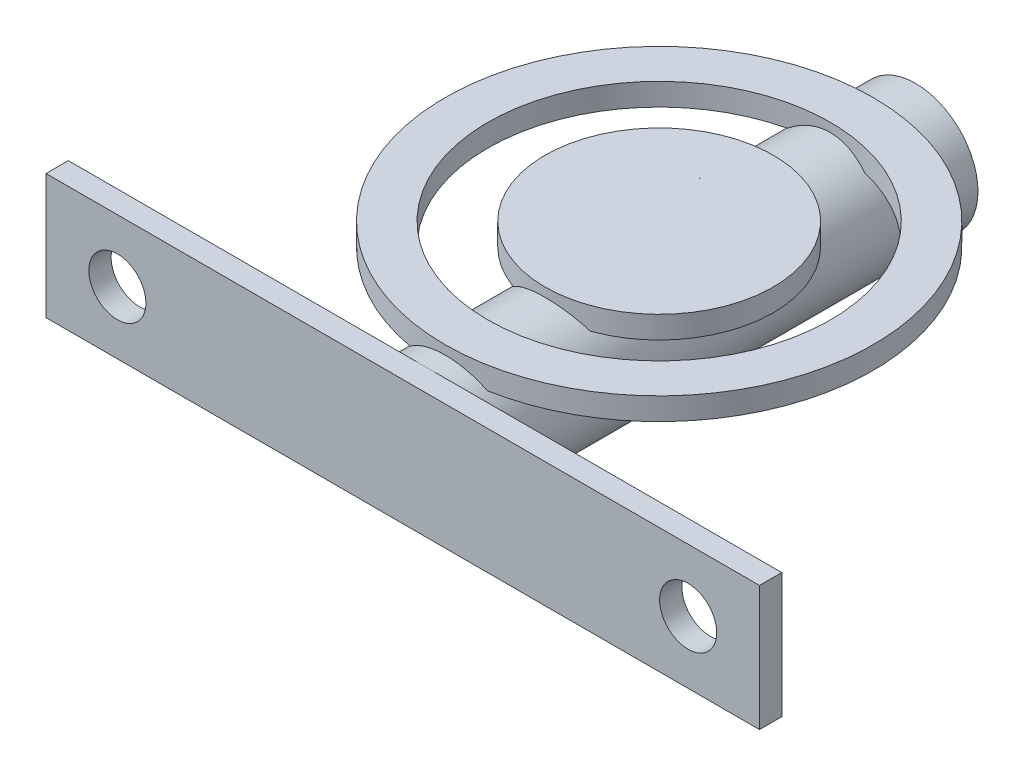
ISO-10303-21;
HEADER;
FILE_DESCRIPTION(('STEP AP214'),'2;1');
FILE_NAME('part.step','',(''),(''),'','','');
FILE_SCHEMA(('AUTOMOTIVE_DESIGN { 1 0 10303 214 1 1 1 1 }'));
ENDSEC;
DATA;
#1=APPLICATION_CONTEXT('core data for automotive mechanical design processes');
#2=APPLICATION_PROTOCOL_DEFINITION('international standard','automotive_design',2000,#1);
#3=PRODUCT_CONTEXT('',#1,'mechanical');
#4=PRODUCT('Part','Part','',(#3));
#5=PRODUCT_RELATED_PRODUCT_CATEGORY('part','',(#4));
#6=PRODUCT_DEFINITION_FORMATION('','',#4);
#7=PRODUCT_DEFINITION_CONTEXT('part definition',#1,'design');
#8=PRODUCT_DEFINITION('design','',#6,#7);
#9=PRODUCT_DEFINITION_SHAPE('','',#8);
#10=(LENGTH_UNIT() NAMED_UNIT(*) SI_UNIT(.MILLI.,.METRE.));
#11=(NAMED_UNIT(*) PLANE_ANGLE_UNIT() SI_UNIT($,.RADIAN.));
#12=(NAMED_UNIT(*) SI_UNIT($,.STERADIAN.) SOLID_ANGLE_UNIT());
#13=UNCERTAINTY_MEASURE_WITH_UNIT(LENGTH_MEASURE(1.E-05),#10,'distance_accuracy_value','');
#14=(GEOMETRIC_REPRESENTATION_CONTEXT(3) GLOBAL_UNCERTAINTY_ASSIGNED_CONTEXT((#13)) GLOBAL_UNIT_ASSIGNED_CONTEXT((#10,
#11,#12)) REPRESENTATION_CONTEXT('',''));
#15=CARTESIAN_POINT('',(0.,0.,0.));
#16=DIRECTION('',(0.,0.,1.));
#17=DIRECTION('',(1.,0.,0.));
#18=AXIS2_PLACEMENT_3D('',#15,#16,#17);
#19=CARTESIAN_POINT('',(0.,0.,27.5));
#20=DIRECTION('',(0.,0.,-1.));
#21=DIRECTION('',(-1.,0.,0.));
#22=AXIS2_PLACEMENT_3D('',#19,#20,#21);
#23=CYLINDRICAL_SURFACE('',#22,3.5);
#24=DIRECTION('',(0.,0.,-1.));
#25=VECTOR('',#24,1.);
#26=CARTESIAN_POINT('',(2.1650635094611,2.75,27.5));
#27=LINE('',#26,#25);
#28=CARTESIAN_POINT('',(2.1650635094611,2.75,26.1780716341129));
#29=VERTEX_POINT('',#28);
#30=CARTESIAN_POINT('',(2.1650635094611,2.75,23.7276734145911));
#31=VERTEX_POINT('',#30);
#32=EDGE_CURVE('E64',#29,#31,#27,.T.);
#33=ORIENTED_EDGE('',*,*,#32,.F.);
#34=CARTESIAN_POINT('',(2.1650635094611,2.75,26.1780716341129));
#35=CARTESIAN_POINT('',(2.08923507612227,2.80970782312858,26.1919859361159));
#36=CARTESIAN_POINT('',(2.01089348860059,2.86629627500496,26.205596187318));
#37=CARTESIAN_POINT('',(1.84968025724275,2.97287921046471,26.2318682263467));
#38=CARTESIAN_POINT('',(1.76680796641174,3.02287274878205,26.244529878096));
#39=CARTESIAN_POINT('',(1.5969553824648,3.1159460414292,26.2685737941807));
#40=CARTESIAN_POINT('',(1.50997053972057,3.15901789531874,26.2799545921679));
#41=CARTESIAN_POINT('',(1.3325927656807,3.23784335477752,26.3011140756907));
#42=CARTESIAN_POINT('',(1.24220005154245,3.27359742572245,26.3108928630986));
#43=CARTESIAN_POINT('',(0.966513524701702,3.36951806181858,26.3374324857215));
#44=CARTESIAN_POINT('',(0.776810018098517,3.41828895035713,26.3513821352277));
#45=CARTESIAN_POINT('',(0.391799068541982,3.48347551788956,26.3701499978747));
#46=CARTESIAN_POINT('',(0.196498951607603,3.49993169559008,26.3749796404557));
#47=CARTESIAN_POINT('',(-0.189204726580534,3.50006618643793,26.3750197308492));
#48=CARTESIAN_POINT('',(-0.379608442531774,3.48455494954174,26.3704680181214));
#49=CARTESIAN_POINT('',(-0.755252719672539,3.42283892258634,26.3526855106333));
#50=CARTESIAN_POINT('',(-0.940487155426601,3.3765992059086,26.3394448400405));
#51=CARTESIAN_POINT('',(-1.21492882473966,3.28389529786848,26.3137212722393));
#52=CARTESIAN_POINT('',(-1.30806806343169,3.24790826750086,26.3038491809761));
#53=CARTESIAN_POINT('',(-1.49080673635844,3.16818866535957,26.2823900326736));
#54=CARTESIAN_POINT('',(-1.58040574544987,3.12445516675563,26.270802770449));
#55=CARTESIAN_POINT('',(-1.75534151494423,3.02963211048425,26.2462498490367));
#56=CARTESIAN_POINT('',(-1.84068083428746,2.97854704256386,26.2332850324038));
#57=CARTESIAN_POINT('',(-2.00658541927086,2.86940493823545,26.2063443941294));
#58=CARTESIAN_POINT('',(-2.08715163822699,2.81134930109518,26.192368775619));
#59=CARTESIAN_POINT('',(-2.1650635094611,2.75,26.1780716341129));
#60=B_SPLINE_CURVE_WITH_KNOTS('',3,(#34,#35,#36,#37,#38,#39,#40,#41,#42,#43,#44,#45,#46,#47,#48,
#49,#50,#51,#52,#53,#54,#55,#56,#57,#58,#59),.UNSPECIFIED.,.F.,.F.,(4,2,2,2,2,2,2,2,2,2,2,2,4),
(0.,0.292453883633062,0.584949639997232,0.877776916713826,1.170585565238,1.75653892562013,
2.341757464733,2.91232194339314,3.48353604904825,3.78423065544071,4.08496126292863,
4.38550898170442,4.68599646926957),.UNSPECIFIED.);
#61=CARTESIAN_POINT('',(-2.1650635094611,2.75,26.1780716341129));
#62=VERTEX_POINT('',#61);
#63=EDGE_CURVE('E133',#29,#62,#60,.T.);
#64=ORIENTED_EDGE('',*,*,#63,.T.);
#65=DIRECTION('',(0.,0.,-1.));
#66=VECTOR('',#65,1.);
#67=CARTESIAN_POINT('',(-2.1650635094611,2.75,27.5));
#68=LINE('',#67,#66);
#69=CARTESIAN_POINT('',(-2.1650635094611,2.75,23.7276734145911));
#70=VERTEX_POINT('',#69);
#71=EDGE_CURVE('E136',#70,#62,#68,.F.);
#72=ORIENTED_EDGE('',*,*,#71,.F.);
#73=CARTESIAN_POINT('',(2.1650635094611,2.75,23.7276734145911));
#74=CARTESIAN_POINT('',(2.09007848964643,2.80904203228148,23.7450376177243));
#75=CARTESIAN_POINT('',(2.01261334468774,2.8650545994467,23.7620143066468));
#76=CARTESIAN_POINT('',(1.85316940396815,2.97067361021915,23.7947856266313));
#77=CARTESIAN_POINT('',(1.77118951919789,3.02027849847833,23.8105799703107));
#78=CARTESIAN_POINT('',(1.60303283061728,3.11279769179636,23.8406005101795));
#79=CARTESIAN_POINT('',(1.51684802247563,3.15569852687977,23.8548235328514));
#80=CARTESIAN_POINT('',(1.34101670947158,3.2343413142549,23.8812926884846));
#81=CARTESIAN_POINT('',(1.25137051701032,3.27008391080771,23.8935389993361));
#82=CARTESIAN_POINT('',(0.977703230001124,3.366219384923,23.9268448076211));
#83=CARTESIAN_POINT('',(0.789144472790432,3.41541464699033,23.944435926958));
#84=CARTESIAN_POINT('',(0.406167809361418,3.48177525672721,23.9683203626207));
#85=CARTESIAN_POINT('',(0.211760585692279,3.49899578026638,23.9746331402319));
#86=CARTESIAN_POINT('',(-0.169892828320654,3.50088277387004,23.9753225550294));
#87=CARTESIAN_POINT('',(-0.35713329139373,3.4867495044247,23.97013927672));
#88=CARTESIAN_POINT('',(-0.726725914208579,3.4288306742192,23.9492438433954));
#89=CARTESIAN_POINT('',(-0.909069929613905,3.38499855002254,23.9335151551347));
#90=CARTESIAN_POINT('',(-1.18421614941736,3.29519570318456,23.9021954517334));
#91=CARTESIAN_POINT('',(-1.28066393640044,3.25890837573135,23.8896753166443));
#92=CARTESIAN_POINT('',(-1.46975856808108,3.17810770633876,23.8623028971652));
#93=CARTESIAN_POINT('',(-1.56240456577576,3.13359254334379,23.8474500965991));
#94=CARTESIAN_POINT('',(-1.74308425979773,3.03679995855194,23.8158717594929));
#95=CARTESIAN_POINT('',(-1.8311222042003,2.98452986266632,23.7991479940392));
#96=CARTESIAN_POINT('',(-2.00207060569453,2.87265656727054,23.7643214589913));
#97=CARTESIAN_POINT('',(-2.08498306705242,2.81305626176847,23.7462192346886));
#98=CARTESIAN_POINT('',(-2.1650635094611,2.75,23.7276734145911));
#99=B_SPLINE_CURVE_WITH_KNOTS('',3,(#73,#74,#75,#76,#77,#78,#79,#80,#81,#82,#83,#84,#85,#86,#87,
#88,#89,#90,#91,#92,#93,#94,#95,#96,#97,#98),.UNSPECIFIED.,.F.,.F.,(4,2,2,2,2,2,2,2,2,2,2,2,4),
(0.,0.290944339311271,0.581959167916546,0.873551395328674,1.16511736683517,1.74890372302307,
2.33168175312336,2.89253663216908,3.45427289019452,3.76532947560772,4.07645498936921,
4.38728843953659,4.69799956248631),.UNSPECIFIED.);
#100=EDGE_CURVE('E143',#31,#70,#99,.T.);
#101=ORIENTED_EDGE('',*,*,#100,.F.);
#102=EDGE_LOOP('',(#33,#64,#72,#101));
#103=FACE_BOUND('',#102,.T.);
#104=CARTESIAN_POINT('',(0.,0.,0.));
#105=DIRECTION('',(0.,0.,1.));
#106=DIRECTION('',(1.,0.,0.));
#107=AXIS2_PLACEMENT_3D('',#104,#105,#106);
#108=CIRCLE('',#107,3.5);
#109=CARTESIAN_POINT('',(3.5,0.,0.));
#110=VERTEX_POINT('',#109);
#111=EDGE_CURVE('E223',#110,#110,#108,.T.);
#112=ORIENTED_EDGE('',*,*,#111,.T.);
#113=EDGE_LOOP('',(#112));
#114=FACE_BOUND('',#113,.T.);
#115=CARTESIAN_POINT('',(0.,0.,27.5));
#116=DIRECTION('',(0.,0.,1.));
#117=DIRECTION('',(1.,0.,0.));
#118=AXIS2_PLACEMENT_3D('',#115,#116,#117);
#119=CIRCLE('',#118,3.5);
#120=CARTESIAN_POINT('',(0.,3.5,27.5));
#121=VERTEX_POINT('',#120);
#122=CARTESIAN_POINT('',(0.,-3.5,27.5));
#123=VERTEX_POINT('',#122);
#124=EDGE_CURVE('E226',#121,#123,#119,.T.);
#125=ORIENTED_EDGE('',*,*,#124,.F.);
#126=EDGE_CURVE('E230',#123,#121,#119,.T.);
#127=ORIENTED_EDGE('',*,*,#126,.F.);
#128=EDGE_LOOP('',(#125,#127));
#129=FACE_BOUND('',#128,.T.);
#130=DIRECTION('',(0.,0.,-1.));
#131=VECTOR('',#130,1.);
#132=CARTESIAN_POINT('',(2.1650635094611,2.75,27.5));
#133=LINE('',#132,#131);
#134=CARTESIAN_POINT('',(2.1650635094611,2.75,20.3976655228395));
#135=VERTEX_POINT('',#134);
#136=CARTESIAN_POINT('',(2.1650635094611,2.75,8.35233447716047));
#137=VERTEX_POINT('',#136);
#138=EDGE_CURVE('E153',#135,#137,#133,.T.);
#139=ORIENTED_EDGE('',*,*,#138,.F.);
#140=CARTESIAN_POINT('',(2.1650635094611,2.75,20.3976655228395));
#141=CARTESIAN_POINT('',(2.09297858717266,2.8067539200769,20.423585994043));
#142=CARTESIAN_POINT('',(2.01851190059977,2.86078744533916,20.4488872352543));
#143=CARTESIAN_POINT('',(1.86510959308769,2.96308447089887,20.497730495681));
#144=CARTESIAN_POINT('',(1.78617156953678,3.01134482488161,20.521271553019));
#145=CARTESIAN_POINT('',(1.62389224901648,3.10187567065977,20.5661295036181));
#146=CARTESIAN_POINT('',(1.54053535324926,3.1441226936967,20.5874376011903));
#147=CARTESIAN_POINT('',(1.37018655086965,3.22201412479249,20.627220356005));
#148=CARTESIAN_POINT('',(1.28319526328825,3.25765965168328,20.6456954932906));
#149=CARTESIAN_POINT('',(1.01679624477149,3.35437025956068,20.6962909959456));
#150=CARTESIAN_POINT('',(0.832431300063351,3.40494663630421,20.7234479593418));
#151=CARTESIAN_POINT('',(0.456744823871,3.47531681050127,20.7614656694579));
#152=CARTESIAN_POINT('',(0.265440616401544,3.49518250323219,20.7723644752491));
#153=CARTESIAN_POINT('',(-0.103883967943103,3.50296702389805,20.7766235405937));
#154=CARTESIAN_POINT('',(-0.281845256629886,3.49313048667505,20.7712161243156));
#155=CARTESIAN_POINT('',(-0.633340200465273,3.44678562247987,20.7460245958241));
#156=CARTESIAN_POINT('',(-0.806870028911887,3.41025500011838,20.7262284659668));
#157=CARTESIAN_POINT('',(-1.14205836519336,3.31296475841078,20.6745297390603));
#158=CARTESIAN_POINT('',(-1.3038572664223,3.25258201989533,20.6428158142741));
#159=CARTESIAN_POINT('',(-1.61498961395128,3.10983363281752,20.5699420236918));
#160=CARTESIAN_POINT('',(-1.76433418873819,3.02748789152451,20.5287907166513));
#161=CARTESIAN_POINT('',(-1.95085122950528,2.90637758208994,20.4706040786042));
#162=CARTESIAN_POINT('',(-1.99480941859512,2.87638058468757,20.4563501356682));
#163=CARTESIAN_POINT('',(-2.08112157786131,2.81455840175316,20.4273544325555));
#164=CARTESIAN_POINT('',(-2.12347839324996,2.78273673853616,20.412613634081));
#165=CARTESIAN_POINT('',(-2.16506350946117,2.75000000000012,20.3976655228395));
#166=B_SPLINE_CURVE_WITH_KNOTS('',3,(#140,#141,#142,#143,#144,#145,#146,#147,#148,#149,#150,
#151,#152,#153,#154,#155,#156,#157,#158,#159,#160,#161,#162,#163,#164,#165),.UNSPECIFIED.,.F.,
.F.,(4,2,2,2,2,2,2,2,2,2,2,2,4),(0.,0.285958361441755,0.572071863820251,0.859273065727793,
1.14642554769114,1.7223679371048,2.2969599631703,2.82924306387309,3.36197124606037,
3.88659859525999,4.41075202868991,4.57599672517809,4.74093252422038),.UNSPECIFIED.);
#167=CARTESIAN_POINT('',(-2.1650635094611,2.75,20.3976655228395));
#168=VERTEX_POINT('',#167);
#169=EDGE_CURVE('E246',#135,#168,#166,.T.);
#170=ORIENTED_EDGE('',*,*,#169,.T.);
#171=DIRECTION('',(0.,0.,-1.));
#172=VECTOR('',#171,1.);
#173=CARTESIAN_POINT('',(-2.1650635094611,2.75,27.5));
#174=LINE('',#173,#172);
#175=CARTESIAN_POINT('',(-2.1650635094611,2.75,8.35233447716047));
#176=VERTEX_POINT('',#175);
#177=EDGE_CURVE('E229',#176,#168,#174,.F.);
#178=ORIENTED_EDGE('',*,*,#177,.F.);
#179=CARTESIAN_POINT('',(-2.1650635094611,2.75,8.35233447716047));
#180=CARTESIAN_POINT('',(-2.09297858717266,2.8067539200769,8.32641400595699));
#181=CARTESIAN_POINT('',(-2.01851190059977,2.86078744533916,8.3011127647457));
#182=CARTESIAN_POINT('',(-1.86510959308769,2.96308447089887,8.25226950431897));
#183=CARTESIAN_POINT('',(-1.78617156953678,3.01134482488161,8.22872844698104));
#184=CARTESIAN_POINT('',(-1.62389224901648,3.10187567065977,8.18387049638189));
#185=CARTESIAN_POINT('',(-1.54053535324926,3.1441226936967,8.16256239880969));
#186=CARTESIAN_POINT('',(-1.37018655086965,3.22201412479249,8.122779643995));
#187=CARTESIAN_POINT('',(-1.28319526328825,3.25765965168328,8.10430450670944));
#188=CARTESIAN_POINT('',(-1.01679624477149,3.35437025956068,8.05370900405438));
#189=CARTESIAN_POINT('',(-0.83243130006335,3.40494663630421,8.02655204065818));
#190=CARTESIAN_POINT('',(-0.456744823871,3.47531681050127,7.98853433054215));
#191=CARTESIAN_POINT('',(-0.265440616401544,3.49518250323219,7.97763552475092));
#192=CARTESIAN_POINT('',(0.103883967943103,3.50296702389805,7.97337645940631));
#193=CARTESIAN_POINT('',(0.281845256629887,3.49313048667505,7.97878387568441));
#194=CARTESIAN_POINT('',(0.633340200465274,3.44678562247987,8.00397540417593));
#195=CARTESIAN_POINT('',(0.806870028911887,3.41025500011838,8.02377153403318));
#196=CARTESIAN_POINT('',(1.14205836519336,3.31296475841078,8.07547026093975));
#197=CARTESIAN_POINT('',(1.30385726642231,3.25258201989533,8.10718418572592));
#198=CARTESIAN_POINT('',(1.61498961395128,3.10983363281752,8.18005797630824));
#199=CARTESIAN_POINT('',(1.76433418873819,3.02748789152451,8.22120928334866));
#200=CARTESIAN_POINT('',(1.95085122950528,2.90637758208994,8.27939592139581));
#201=CARTESIAN_POINT('',(1.99480941859512,2.87638058468757,8.29364986433178));
#202=CARTESIAN_POINT('',(2.08112157786131,2.81455840175316,8.32264556744448));
#203=CARTESIAN_POINT('',(2.12347839324996,2.78273673853616,8.33738636591902));
#204=CARTESIAN_POINT('',(2.16506350946117,2.75000000000012,8.35233447716047));
#205=B_SPLINE_CURVE_WITH_KNOTS('',3,(#179,#180,#181,#182,#183,#184,#185,#186,#187,#188,#189,
#190,#191,#192,#193,#194,#195,#196,#197,#198,#199,#200,#201,#202,#203,#204),.UNSPECIFIED.,.F.,
.F.,(4,2,2,2,2,2,2,2,2,2,2,2,4),(0.,0.285958361441756,0.572071863820251,0.859273065727795,
1.14642554769114,1.7223679371048,2.2969599631703,2.82924306387309,3.36197124606037,
3.88659859525999,4.41075202868991,4.57599672517809,4.74093252422038),.UNSPECIFIED.);
#206=EDGE_CURVE('E239',#176,#137,#205,.T.);
#207=ORIENTED_EDGE('',*,*,#206,.T.);
#208=EDGE_LOOP('',(#139,#170,#178,#207));
#209=FACE_BOUND('',#208,.T.);
#210=CARTESIAN_POINT('',(2.1650635094611,2.75,5.02232658540886));
#211=VERTEX_POINT('',#210);
#212=CARTESIAN_POINT('',(2.1650635094611,2.75,2.57192836588712));
#213=VERTEX_POINT('',#212);
#214=EDGE_CURVE('E12',#211,#213,#27,.T.);
#215=ORIENTED_EDGE('',*,*,#214,.F.);
#216=CARTESIAN_POINT('',(-2.1650635094611,2.75,5.02232658540886));
#217=CARTESIAN_POINT('',(-2.09007848964643,2.80904203228148,5.00496238227573));
#218=CARTESIAN_POINT('',(-2.01261334468774,2.8650545994467,4.98798569335324));
#219=CARTESIAN_POINT('',(-1.85316940396815,2.97067361021915,4.95521437336872));
#220=CARTESIAN_POINT('',(-1.7711895191979,3.02027849847833,4.93942002968933));
#221=CARTESIAN_POINT('',(-1.60303283061728,3.11279769179636,4.90939948982051));
#222=CARTESIAN_POINT('',(-1.51684802247563,3.15569852687977,4.89517646714855));
#223=CARTESIAN_POINT('',(-1.34101670947158,3.2343413142549,4.86870731151537));
#224=CARTESIAN_POINT('',(-1.25137051701032,3.27008391080771,4.85646100066394));
#225=CARTESIAN_POINT('',(-0.977703230001125,3.366219384923,4.82315519237886));
#226=CARTESIAN_POINT('',(-0.789144472790433,3.41541464699033,4.80556407304202));
#227=CARTESIAN_POINT('',(-0.406167809361419,3.48177525672721,4.78167963737928));
#228=CARTESIAN_POINT('',(-0.21176058569228,3.49899578026638,4.77536685976808));
#229=CARTESIAN_POINT('',(0.169892828320653,3.50088277387004,4.77467744497056));
#230=CARTESIAN_POINT('',(0.357133291393728,3.4867495044247,4.77986072327996));
#231=CARTESIAN_POINT('',(0.726725914208578,3.4288306742192,4.80075615660462));
#232=CARTESIAN_POINT('',(0.909069929613904,3.38499855002254,4.81648484486528));
#233=CARTESIAN_POINT('',(1.18421614941736,3.29519570318456,4.84780454826661));
#234=CARTESIAN_POINT('',(1.28066393640043,3.25890837573135,4.86032468335566));
#235=CARTESIAN_POINT('',(1.46975856808109,3.17810770633876,4.88769710283476));
#236=CARTESIAN_POINT('',(1.56240456577576,3.13359254334379,4.90254990340088));
#237=CARTESIAN_POINT('',(1.74308425979773,3.03679995855194,4.93412824050711));
#238=CARTESIAN_POINT('',(1.8311222042003,2.98452986266632,4.95085200596076));
#239=CARTESIAN_POINT('',(2.00207060569453,2.87265656727054,4.98567854100868));
#240=CARTESIAN_POINT('',(2.08498306705242,2.81305626176847,5.00378076531144));
#241=CARTESIAN_POINT('',(2.1650635094611,2.75,5.02232658540886));
#242=B_SPLINE_CURVE_WITH_KNOTS('',3,(#216,#217,#218,#219,#220,#221,#222,#223,#224,#225,#226,
#227,#228,#229,#230,#231,#232,#233,#234,#235,#236,#237,#238,#239,#240,#241),.UNSPECIFIED.,.F.,
.F.,(4,2,2,2,2,2,2,2,2,2,2,2,4),(0.,0.290944339311271,0.581959167916545,0.873551395328674,
1.16511736683517,1.74890372302307,2.33168175312336,2.89253663216908,3.45427289019452,
3.76532947560772,4.07645498936921,4.38728843953659,4.69799956248631),.UNSPECIFIED.);
#243=CARTESIAN_POINT('',(-2.1650635094611,2.75,5.02232658540886));
#244=VERTEX_POINT('',#243);
#245=EDGE_CURVE('E351',#244,#211,#242,.T.);
#246=ORIENTED_EDGE('',*,*,#245,.F.);
#247=CARTESIAN_POINT('',(-2.1650635094611,2.75,2.57192836588712));
#248=VERTEX_POINT('',#247);
#249=EDGE_CURVE('E155',#248,#244,#68,.F.);
#250=ORIENTED_EDGE('',*,*,#249,.F.);
#251=CARTESIAN_POINT('',(-2.1650635094611,2.75,2.57192836588712));
#252=CARTESIAN_POINT('',(-2.08923507612227,2.80970782312858,2.55801406388408));
#253=CARTESIAN_POINT('',(-2.01089348860059,2.86629627500496,2.54440381268202));
#254=CARTESIAN_POINT('',(-1.84968025724275,2.97287921046471,2.51813177365329));
#255=CARTESIAN_POINT('',(-1.76680796641174,3.02287274878205,2.50547012190396));
#256=CARTESIAN_POINT('',(-1.5969553824648,3.1159460414292,2.48142620581933));
#257=CARTESIAN_POINT('',(-1.50997053972057,3.15901789531874,2.47004540783215));
#258=CARTESIAN_POINT('',(-1.3325927656807,3.23784335477752,2.44888592430929));
#259=CARTESIAN_POINT('',(-1.24220005154245,3.27359742572245,2.43910713690137));
#260=CARTESIAN_POINT('',(-0.966513524701702,3.36951806181858,2.41256751427853));
#261=CARTESIAN_POINT('',(-0.776810018098517,3.41828895035713,2.39861786477227));
#262=CARTESIAN_POINT('',(-0.391799068541981,3.48347551788956,2.37985000212527));
#263=CARTESIAN_POINT('',(-0.196498951607603,3.49993169559008,2.3750203595443));
#264=CARTESIAN_POINT('',(0.189204726580534,3.50006618643794,2.37498026915077));
#265=CARTESIAN_POINT('',(0.379608442531774,3.48455494954174,2.37953198187866));
#266=CARTESIAN_POINT('',(0.755252719672539,3.42283892258634,2.39731448936669));
#267=CARTESIAN_POINT('',(0.940487155426602,3.3765992059086,2.41055515995952));
#268=CARTESIAN_POINT('',(1.21492882473966,3.28389529786848,2.4362787277607));
#269=CARTESIAN_POINT('',(1.30806806343169,3.24790826750086,2.44615081902389));
#270=CARTESIAN_POINT('',(1.49080673635844,3.16818866535957,2.46760996732643));
#271=CARTESIAN_POINT('',(1.58040574544987,3.12445516675563,2.47919722955104));
#272=CARTESIAN_POINT('',(1.75534151494423,3.02963211048425,2.50375015096334));
#273=CARTESIAN_POINT('',(1.84068083428746,2.97854704256386,2.51671496759623));
#274=CARTESIAN_POINT('',(2.00658541927086,2.86940493823545,2.54365560587057));
#275=CARTESIAN_POINT('',(2.08715163822699,2.81134930109518,2.55763122438105));
#276=CARTESIAN_POINT('',(2.1650635094611,2.75,2.57192836588712));
#277=B_SPLINE_CURVE_WITH_KNOTS('',3,(#251,#252,#253,#254,#255,#256,#257,#258,#259,#260,#261,
#262,#263,#264,#265,#266,#267,#268,#269,#270,#271,#272,#273,#274,#275,#276),.UNSPECIFIED.,.F.,
.F.,(4,2,2,2,2,2,2,2,2,2,2,2,4),(0.,0.292453883633062,0.584949639997232,0.877776916713826,
1.170585565238,1.75653892562013,2.341757464733,2.91232194339314,3.48353604904825,
3.78423065544071,4.08496126292863,4.38550898170442,4.68599646926957),.UNSPECIFIED.);
#278=EDGE_CURVE('E53',#248,#213,#277,.T.);
#279=ORIENTED_EDGE('',*,*,#278,.T.);
#280=EDGE_LOOP('',(#215,#246,#250,#279));
#281=FACE_BOUND('',#280,.T.);
#282=ADVANCED_FACE('F49',(#103,#114,#129,#209,#281),#23,.T.);
#283=CARTESIAN_POINT('',(0.,0.,0.));
#284=DIRECTION('',(0.,0.,1.));
#285=DIRECTION('',(1.,0.,0.));
#286=AXIS2_PLACEMENT_3D('',#283,#284,#285);
#287=PLANE('',#286);
#288=CARTESIAN_POINT('',(0.,0.,0.));
#289=DIRECTION('',(0.,0.,-1.));
#290=DIRECTION('',(-1.,0.,0.));
#291=AXIS2_PLACEMENT_3D('',#288,#289,#290);
#292=CIRCLE('',#291,2.25);
#293=CARTESIAN_POINT('',(-2.25,0.,0.));
#294=VERTEX_POINT('',#293);
#295=EDGE_CURVE('E219',#294,#294,#292,.T.);
#296=ORIENTED_EDGE('',*,*,#295,.F.);
#297=EDGE_LOOP('',(#296));
#298=FACE_BOUND('',#297,.T.);
#299=ORIENTED_EDGE('',*,*,#111,.F.);
#300=EDGE_LOOP('',(#299));
#301=FACE_BOUND('',#300,.T.);
#302=ADVANCED_FACE('F300',(#298,#301),#287,.F.);
#303=CARTESIAN_POINT('',(0.,0.,8.2));
#304=DIRECTION('',(0.,0.,-1.));
#305=DIRECTION('',(-1.,0.,0.));
#306=AXIS2_PLACEMENT_3D('',#303,#304,#305);
#307=CYLINDRICAL_SURFACE('',#306,2.25);
#308=CARTESIAN_POINT('',(0.,0.,8.2));
#309=DIRECTION('',(0.,0.,-1.));
#310=DIRECTION('',(-1.,0.,0.));
#311=AXIS2_PLACEMENT_3D('',#308,#309,#310);
#312=CIRCLE('',#311,2.25);
#313=CARTESIAN_POINT('',(-2.25,0.,8.2));
#314=VERTEX_POINT('',#313);
#315=EDGE_CURVE('E220',#314,#314,#312,.T.);
#316=ORIENTED_EDGE('',*,*,#315,.F.);
#317=EDGE_LOOP('',(#316));
#318=FACE_BOUND('',#317,.T.);
#319=ORIENTED_EDGE('',*,*,#295,.T.);
#320=EDGE_LOOP('',(#319));
#321=FACE_BOUND('',#320,.T.);
#322=ADVANCED_FACE('F297',(#318,#321),#307,.F.);
#323=CARTESIAN_POINT('',(0.,0.,8.2));
#324=DIRECTION('',(0.,0.,-1.));
#325=DIRECTION('',(-1.,0.,0.));
#326=AXIS2_PLACEMENT_3D('',#323,#324,#325);
#327=PLANE('',#326);
#328=ORIENTED_EDGE('',*,*,#315,.T.);
#329=EDGE_LOOP('',(#328));
#330=FACE_BOUND('',#329,.T.);
#331=ADVANCED_FACE('F278',(#330),#327,.T.);
#332=CARTESIAN_POINT('',(0.,0.,27.5));
#333=DIRECTION('',(0.,0.,1.));
#334=DIRECTION('',(1.,0.,0.));
#335=AXIS2_PLACEMENT_3D('',#332,#333,#334);
#336=PLANE('',#335);
#337=CARTESIAN_POINT('',(-16.,0.,27.5));
#338=DIRECTION('',(0.,0.,1.));
#339=DIRECTION('',(1.,0.,0.));
#340=AXIS2_PLACEMENT_3D('',#337,#338,#339);
#341=CIRCLE('',#340,1.6);
#342=CARTESIAN_POINT('',(-14.4,0.,27.5));
#343=VERTEX_POINT('',#342);
#344=EDGE_CURVE('E176',#343,#343,#341,.T.);
#345=ORIENTED_EDGE('',*,*,#344,.T.);
#346=EDGE_LOOP('',(#345));
#347=FACE_BOUND('',#346,.T.);
#348=DIRECTION('',(1.,0.,0.));
#349=VECTOR('',#348,1.);
#350=CARTESIAN_POINT('',(-20.,3.5,27.5));
#351=LINE('',#350,#349);
#352=CARTESIAN_POINT('',(-20.,3.5,27.5));
#353=VERTEX_POINT('',#352);
#354=EDGE_CURVE('E186',#353,#121,#351,.T.);
#355=ORIENTED_EDGE('',*,*,#354,.T.);
#356=ORIENTED_EDGE('',*,*,#124,.T.);
#357=DIRECTION('',(1.,0.,0.));
#358=VECTOR('',#357,1.);
#359=CARTESIAN_POINT('',(-20.,-3.5,27.5));
#360=LINE('',#359,#358);
#361=CARTESIAN_POINT('',(-20.,-3.5,27.5));
#362=VERTEX_POINT('',#361);
#363=EDGE_CURVE('E200',#362,#123,#360,.T.);
#364=ORIENTED_EDGE('',*,*,#363,.F.);
#365=DIRECTION('',(0.,-1.,0.));
#366=VECTOR('',#365,1.);
#367=CARTESIAN_POINT('',(-20.,3.5,27.5));
#368=LINE('',#367,#366);
#369=EDGE_CURVE('E195',#353,#362,#368,.T.);
#370=ORIENTED_EDGE('',*,*,#369,.F.);
#371=EDGE_LOOP('',(#355,#356,#364,#370));
#372=FACE_BOUND('',#371,.T.);
#373=ADVANCED_FACE('F274',(#347,#372),#336,.F.);
#374=CARTESIAN_POINT('',(16.,0.,27.5));
#375=DIRECTION('',(0.,0.,1.));
#376=DIRECTION('',(1.,0.,0.));
#377=AXIS2_PLACEMENT_3D('',#374,#375,#376);
#378=CIRCLE('',#377,1.6);
#379=CARTESIAN_POINT('',(17.6,0.,27.5));
#380=VERTEX_POINT('',#379);
#381=EDGE_CURVE('E175',#380,#380,#378,.T.);
#382=ORIENTED_EDGE('',*,*,#381,.T.);
#383=EDGE_LOOP('',(#382));
#384=FACE_BOUND('',#383,.T.);
#385=CARTESIAN_POINT('',(20.,-3.5,27.5));
#386=VERTEX_POINT('',#385);
#387=EDGE_CURVE('E198',#123,#386,#360,.T.);
#388=ORIENTED_EDGE('',*,*,#387,.F.);
#389=ORIENTED_EDGE('',*,*,#126,.T.);
#390=CARTESIAN_POINT('',(20.,3.5,27.5));
#391=VERTEX_POINT('',#390);
#392=EDGE_CURVE('E206',#121,#391,#351,.T.);
#393=ORIENTED_EDGE('',*,*,#392,.T.);
#394=DIRECTION('',(0.,-1.,0.));
#395=VECTOR('',#394,1.);
#396=CARTESIAN_POINT('',(20.,3.5,27.5));
#397=LINE('',#396,#395);
#398=EDGE_CURVE('E203',#391,#386,#397,.T.);
#399=ORIENTED_EDGE('',*,*,#398,.T.);
#400=EDGE_LOOP('',(#388,#389,#393,#399));
#401=FACE_BOUND('',#400,.T.);
#402=ADVANCED_FACE('F277',(#384,#401),#336,.F.);
#403=CARTESIAN_POINT('',(-20.,3.5,28.75));
#404=DIRECTION('',(1.,0.,0.));
#405=DIRECTION('',(0.,0.,-1.));
#406=AXIS2_PLACEMENT_3D('',#403,#404,#405);
#407=PLANE('',#406);
#408=ORIENTED_EDGE('',*,*,#369,.T.);
#409=DIRECTION('',(0.,0.,-1.));
#410=VECTOR('',#409,1.);
#411=CARTESIAN_POINT('',(-20.,-3.5,28.75));
#412=LINE('',#411,#410);
#413=CARTESIAN_POINT('',(-20.,-3.5,28.75));
#414=VERTEX_POINT('',#413);
#415=EDGE_CURVE('E216',#414,#362,#412,.T.);
#416=ORIENTED_EDGE('',*,*,#415,.F.);
#417=DIRECTION('',(0.,-1.,0.));
#418=VECTOR('',#417,1.);
#419=CARTESIAN_POINT('',(-20.,3.5,28.75));
#420=LINE('',#419,#418);
#421=CARTESIAN_POINT('',(-20.,3.5,28.75));
#422=VERTEX_POINT('',#421);
#423=EDGE_CURVE('E182',#422,#414,#420,.T.);
#424=ORIENTED_EDGE('',*,*,#423,.F.);
#425=DIRECTION('',(0.,0.,-1.));
#426=VECTOR('',#425,1.);
#427=CARTESIAN_POINT('',(-20.,3.5,28.75));
#428=LINE('',#427,#426);
#429=EDGE_CURVE('E194',#422,#353,#428,.T.);
#430=ORIENTED_EDGE('',*,*,#429,.T.);
#431=EDGE_LOOP('',(#408,#416,#424,#430));
#432=FACE_BOUND('',#431,.T.);
#433=ADVANCED_FACE('F290',(#432),#407,.F.);
#434=CARTESIAN_POINT('',(-20.,-3.5,28.75));
#435=DIRECTION('',(0.,1.,0.));
#436=DIRECTION('',(0.,0.,1.));
#437=AXIS2_PLACEMENT_3D('',#434,#435,#436);
#438=PLANE('',#437);
#439=ORIENTED_EDGE('',*,*,#363,.T.);
#440=ORIENTED_EDGE('',*,*,#387,.T.);
#441=DIRECTION('',(0.,0.,-1.));
#442=VECTOR('',#441,1.);
#443=CARTESIAN_POINT('',(20.,-3.5,28.75));
#444=LINE('',#443,#442);
#445=CARTESIAN_POINT('',(20.,-3.5,28.75));
#446=VERTEX_POINT('',#445);
#447=EDGE_CURVE('E213',#446,#386,#444,.T.);
#448=ORIENTED_EDGE('',*,*,#447,.F.);
#449=DIRECTION('',(1.,0.,0.));
#450=VECTOR('',#449,1.);
#451=CARTESIAN_POINT('',(-20.,-3.5,28.75));
#452=LINE('',#451,#450);
#453=EDGE_CURVE('E185',#414,#446,#452,.T.);
#454=ORIENTED_EDGE('',*,*,#453,.F.);
#455=ORIENTED_EDGE('',*,*,#415,.T.);
#456=EDGE_LOOP('',(#439,#440,#448,#454,#455));
#457=FACE_BOUND('',#456,.T.);
#458=ADVANCED_FACE('F286',(#457),#438,.F.);
#459=CARTESIAN_POINT('',(20.,3.5,28.75));
#460=DIRECTION('',(1.,0.,0.));
#461=DIRECTION('',(0.,0.,-1.));
#462=AXIS2_PLACEMENT_3D('',#459,#460,#461);
#463=PLANE('',#462);
#464=ORIENTED_EDGE('',*,*,#398,.F.);
#465=DIRECTION('',(0.,0.,-1.));
#466=VECTOR('',#465,1.);
#467=CARTESIAN_POINT('',(20.,3.5,28.75));
#468=LINE('',#467,#466);
#469=CARTESIAN_POINT('',(20.,3.5,28.75));
#470=VERTEX_POINT('',#469);
#471=EDGE_CURVE('E210',#470,#391,#468,.T.);
#472=ORIENTED_EDGE('',*,*,#471,.F.);
#473=DIRECTION('',(0.,-1.,0.));
#474=VECTOR('',#473,1.);
#475=CARTESIAN_POINT('',(20.,3.5,28.75));
#476=LINE('',#475,#474);
#477=EDGE_CURVE('E188',#470,#446,#476,.T.);
#478=ORIENTED_EDGE('',*,*,#477,.T.);
#479=ORIENTED_EDGE('',*,*,#447,.T.);
#480=EDGE_LOOP('',(#464,#472,#478,#479));
#481=FACE_BOUND('',#480,.T.);
#482=ADVANCED_FACE('F282',(#481),#463,.T.);
#483=CARTESIAN_POINT('',(-20.,3.5,28.75));
#484=DIRECTION('',(0.,1.,0.));
#485=DIRECTION('',(0.,0.,1.));
#486=AXIS2_PLACEMENT_3D('',#483,#484,#485);
#487=PLANE('',#486);
#488=ORIENTED_EDGE('',*,*,#354,.F.);
#489=ORIENTED_EDGE('',*,*,#429,.F.);
#490=DIRECTION('',(1.,0.,0.));
#491=VECTOR('',#490,1.);
#492=CARTESIAN_POINT('',(-20.,3.5,28.75));
#493=LINE('',#492,#491);
#494=EDGE_CURVE('E191',#422,#470,#493,.T.);
#495=ORIENTED_EDGE('',*,*,#494,.T.);
#496=ORIENTED_EDGE('',*,*,#471,.T.);
#497=ORIENTED_EDGE('',*,*,#392,.F.);
#498=EDGE_LOOP('',(#488,#489,#495,#496,#497));
#499=FACE_BOUND('',#498,.T.);
#500=ADVANCED_FACE('F272',(#499),#487,.T.);
#501=CARTESIAN_POINT('',(0.,0.,28.75));
#502=DIRECTION('',(0.,0.,1.));
#503=DIRECTION('',(1.,0.,0.));
#504=AXIS2_PLACEMENT_3D('',#501,#502,#503);
#505=PLANE('',#504);
#506=CARTESIAN_POINT('',(-16.,0.,28.75));
#507=DIRECTION('',(0.,0.,1.));
#508=DIRECTION('',(1.,0.,0.));
#509=AXIS2_PLACEMENT_3D('',#506,#507,#508);
#510=CIRCLE('',#509,1.6);
#511=CARTESIAN_POINT('',(-14.4,0.,28.75));
#512=VERTEX_POINT('',#511);
#513=EDGE_CURVE('E199',#512,#512,#510,.F.);
#514=ORIENTED_EDGE('',*,*,#513,.T.);
#515=EDGE_LOOP('',(#514));
#516=FACE_BOUND('',#515,.T.);
#517=CARTESIAN_POINT('',(16.,0.,28.75));
#518=DIRECTION('',(0.,0.,1.));
#519=DIRECTION('',(1.,0.,0.));
#520=AXIS2_PLACEMENT_3D('',#517,#518,#519);
#521=CIRCLE('',#520,1.6);
#522=CARTESIAN_POINT('',(17.6,0.,28.75));
#523=VERTEX_POINT('',#522);
#524=EDGE_CURVE('E179',#523,#523,#521,.F.);
#525=ORIENTED_EDGE('',*,*,#524,.T.);
#526=EDGE_LOOP('',(#525));
#527=FACE_BOUND('',#526,.T.);
#528=ORIENTED_EDGE('',*,*,#423,.T.);
#529=ORIENTED_EDGE('',*,*,#453,.T.);
#530=ORIENTED_EDGE('',*,*,#477,.F.);
#531=ORIENTED_EDGE('',*,*,#494,.F.);
#532=EDGE_LOOP('',(#528,#529,#530,#531));
#533=FACE_BOUND('',#532,.T.);
#534=ADVANCED_FACE('F268',(#516,#527,#533),#505,.T.);
#535=CARTESIAN_POINT('',(16.,0.,29.));
#536=DIRECTION('',(0.,0.,-1.));
#537=DIRECTION('',(-1.,0.,0.));
#538=AXIS2_PLACEMENT_3D('',#535,#536,#537);
#539=CYLINDRICAL_SURFACE('',#538,1.6);
#540=ORIENTED_EDGE('',*,*,#524,.F.);
#541=EDGE_LOOP('',(#540));
#542=FACE_BOUND('',#541,.T.);
#543=ORIENTED_EDGE('',*,*,#381,.F.);
#544=EDGE_LOOP('',(#543));
#545=FACE_BOUND('',#544,.T.);
#546=ADVANCED_FACE('F264',(#542,#545),#539,.F.);
#547=CARTESIAN_POINT('',(-16.,0.,29.));
#548=DIRECTION('',(0.,0.,-1.));
#549=DIRECTION('',(-1.,0.,0.));
#550=AXIS2_PLACEMENT_3D('',#547,#548,#549);
#551=CYLINDRICAL_SURFACE('',#550,1.6);
#552=ORIENTED_EDGE('',*,*,#513,.F.);
#553=EDGE_LOOP('',(#552));
#554=FACE_BOUND('',#553,.T.);
#555=ORIENTED_EDGE('',*,*,#344,.F.);
#556=EDGE_LOOP('',(#555));
#557=FACE_BOUND('',#556,.T.);
#558=ADVANCED_FACE('F258',(#554,#557),#551,.F.);
#559=CARTESIAN_POINT('',(0.,2.75,14.375));
#560=DIRECTION('',(0.,1.,0.));
#561=DIRECTION('',(0.,0.,1.));
#562=AXIS2_PLACEMENT_3D('',#559,#560,#561);
#563=CYLINDRICAL_SURFACE('',#562,6.4);
#564=CARTESIAN_POINT('',(0.,4.,14.375));
#565=DIRECTION('',(0.,1.,0.));
#566=DIRECTION('',(0.,0.,1.));
#567=AXIS2_PLACEMENT_3D('',#564,#565,#566);
#568=CIRCLE('',#567,6.4);
#569=CARTESIAN_POINT('',(0.,4.,20.775));
#570=VERTEX_POINT('',#569);
#571=EDGE_CURVE('E168',#570,#570,#568,.T.);
#572=ORIENTED_EDGE('',*,*,#571,.F.);
#573=EDGE_LOOP('',(#572));
#574=FACE_BOUND('',#573,.T.);
#575=ORIENTED_EDGE('',*,*,#169,.F.);
#576=CARTESIAN_POINT('',(0.,2.75,14.375));
#577=DIRECTION('',(0.,1.,0.));
#578=DIRECTION('',(0.,0.,1.));
#579=AXIS2_PLACEMENT_3D('',#576,#577,#578);
#580=CIRCLE('',#579,6.4);
#581=EDGE_CURVE('E172',#135,#137,#580,.T.);
#582=ORIENTED_EDGE('',*,*,#581,.T.);
#583=ORIENTED_EDGE('',*,*,#206,.F.);
#584=EDGE_CURVE('E171',#176,#168,#580,.T.);
#585=ORIENTED_EDGE('',*,*,#584,.T.);
#586=EDGE_LOOP('',(#575,#582,#583,#585));
#587=FACE_BOUND('',#586,.T.);
#588=ADVANCED_FACE('F252',(#574,#587),#563,.T.);
#589=CARTESIAN_POINT('',(0.,2.75,0.));
#590=DIRECTION('',(0.,1.,0.));
#591=DIRECTION('',(0.,0.,1.));
#592=AXIS2_PLACEMENT_3D('',#589,#590,#591);
#593=PLANE('',#592);
#594=ORIENTED_EDGE('',*,*,#581,.F.);
#595=ORIENTED_EDGE('',*,*,#138,.T.);
#596=EDGE_LOOP('',(#594,#595));
#597=FACE_BOUND('',#596,.T.);
#598=ADVANCED_FACE('F257',(#597),#593,.F.);
#599=ORIENTED_EDGE('',*,*,#584,.F.);
#600=ORIENTED_EDGE('',*,*,#177,.T.);
#601=EDGE_LOOP('',(#599,#600));
#602=FACE_BOUND('',#601,.T.);
#603=ADVANCED_FACE('F322',(#602),#593,.F.);
#604=CARTESIAN_POINT('',(0.,4.,0.));
#605=DIRECTION('',(0.,1.,0.));
#606=DIRECTION('',(0.,0.,1.));
#607=AXIS2_PLACEMENT_3D('',#604,#605,#606);
#608=PLANE('',#607);
#609=ORIENTED_EDGE('',*,*,#571,.T.);
#610=EDGE_LOOP('',(#609));
#611=FACE_BOUND('',#610,.T.);
#612=ADVANCED_FACE('F326',(#611),#608,.T.);
#613=CARTESIAN_POINT('',(0.,2.75,14.375));
#614=DIRECTION('',(0.,1.,0.));
#615=DIRECTION('',(0.,0.,1.));
#616=AXIS2_PLACEMENT_3D('',#613,#614,#615);
#617=CYLINDRICAL_SURFACE('',#616,12.);
#618=CARTESIAN_POINT('',(0.,4.,14.375));
#619=DIRECTION('',(0.,1.,0.));
#620=DIRECTION('',(0.,0.,1.));
#621=AXIS2_PLACEMENT_3D('',#618,#619,#620);
#622=CIRCLE('',#621,12.);
#623=CARTESIAN_POINT('',(0.,4.,26.375));
#624=VERTEX_POINT('',#623);
#625=EDGE_CURVE('E161',#624,#624,#622,.T.);
#626=ORIENTED_EDGE('',*,*,#625,.F.);
#627=EDGE_LOOP('',(#626));
#628=FACE_BOUND('',#627,.T.);
#629=ORIENTED_EDGE('',*,*,#63,.F.);
#630=CARTESIAN_POINT('',(0.,2.75,14.375));
#631=DIRECTION('',(0.,1.,0.));
#632=DIRECTION('',(0.,0.,1.));
#633=AXIS2_PLACEMENT_3D('',#630,#631,#632);
#634=CIRCLE('',#633,12.);
#635=EDGE_CURVE('E157',#29,#213,#634,.T.);
#636=ORIENTED_EDGE('',*,*,#635,.T.);
#637=ORIENTED_EDGE('',*,*,#278,.F.);
#638=EDGE_CURVE('E150',#248,#62,#634,.T.);
#639=ORIENTED_EDGE('',*,*,#638,.T.);
#640=EDGE_LOOP('',(#629,#636,#637,#639));
#641=FACE_BOUND('',#640,.T.);
#642=ADVANCED_FACE('F156',(#628,#641),#617,.T.);
#643=CARTESIAN_POINT('',(0.,2.75,14.375));
#644=DIRECTION('',(0.,1.,0.));
#645=DIRECTION('',(0.,0.,1.));
#646=AXIS2_PLACEMENT_3D('',#643,#644,#645);
#647=CYLINDRICAL_SURFACE('',#646,9.6);
#648=CARTESIAN_POINT('',(0.,4.,14.375));
#649=DIRECTION('',(0.,1.,0.));
#650=DIRECTION('',(0.,0.,1.));
#651=AXIS2_PLACEMENT_3D('',#648,#649,#650);
#652=CIRCLE('',#651,9.6);
#653=CARTESIAN_POINT('',(0.,4.,23.975));
#654=VERTEX_POINT('',#653);
#655=EDGE_CURVE('E158',#654,#654,#652,.T.);
#656=ORIENTED_EDGE('',*,*,#655,.T.);
#657=EDGE_LOOP('',(#656));
#658=FACE_BOUND('',#657,.T.);
#659=CARTESIAN_POINT('',(0.,2.75,14.375));
#660=DIRECTION('',(0.,1.,0.));
#661=DIRECTION('',(0.,0.,1.));
#662=AXIS2_PLACEMENT_3D('',#659,#660,#661);
#663=CIRCLE('',#662,9.6);
#664=EDGE_CURVE('E165',#31,#211,#663,.T.);
#665=ORIENTED_EDGE('',*,*,#664,.F.);
#666=ORIENTED_EDGE('',*,*,#100,.T.);
#667=EDGE_CURVE('E152',#244,#70,#663,.T.);
#668=ORIENTED_EDGE('',*,*,#667,.F.);
#669=ORIENTED_EDGE('',*,*,#245,.T.);
#670=EDGE_LOOP('',(#665,#666,#668,#669));
#671=FACE_BOUND('',#670,.T.);
#672=ADVANCED_FACE('F335',(#658,#671),#647,.F.);
#673=CARTESIAN_POINT('',(0.,2.75,0.));
#674=DIRECTION('',(0.,1.,0.));
#675=DIRECTION('',(0.,0.,1.));
#676=AXIS2_PLACEMENT_3D('',#673,#674,#675);
#677=PLANE('',#676);
#678=ORIENTED_EDGE('',*,*,#635,.F.);
#679=ORIENTED_EDGE('',*,*,#32,.T.);
#680=ORIENTED_EDGE('',*,*,#664,.T.);
#681=ORIENTED_EDGE('',*,*,#214,.T.);
#682=EDGE_LOOP('',(#678,#679,#680,#681));
#683=FACE_BOUND('',#682,.T.);
#684=ADVANCED_FACE('F359',(#683),#677,.F.);
#685=ORIENTED_EDGE('',*,*,#638,.F.);
#686=ORIENTED_EDGE('',*,*,#249,.T.);
#687=ORIENTED_EDGE('',*,*,#667,.T.);
#688=ORIENTED_EDGE('',*,*,#71,.T.);
#689=EDGE_LOOP('',(#685,#686,#687,#688));
#690=FACE_BOUND('',#689,.T.);
#691=ADVANCED_FACE('F148',(#690),#677,.F.);
#692=CARTESIAN_POINT('',(0.,4.,0.));
#693=DIRECTION('',(0.,1.,0.));
#694=DIRECTION('',(0.,0.,1.));
#695=AXIS2_PLACEMENT_3D('',#692,#693,#694);
#696=PLANE('',#695);
#697=ORIENTED_EDGE('',*,*,#625,.T.);
#698=EDGE_LOOP('',(#697));
#699=FACE_BOUND('',#698,.T.);
#700=ORIENTED_EDGE('',*,*,#655,.F.);
#701=EDGE_LOOP('',(#700));
#702=FACE_BOUND('',#701,.T.);
#703=ADVANCED_FACE('F365',(#699,#702),#696,.T.);
#704=CLOSED_SHELL('',(#282,#302,#322,#331,#373,#402,#433,#458,#482,#500,#534,#546,#558,#588,
#598,#603,#612,#642,#672,#684,#691,#703));
#705=MANIFOLD_SOLID_BREP('B2',#704);
#706=ADVANCED_BREP_SHAPE_REPRESENTATION('',(#18,#705),#14);
#707=SHAPE_DEFINITION_REPRESENTATION(#9,#706);
ENDSEC;
END-ISO-10303-21;
